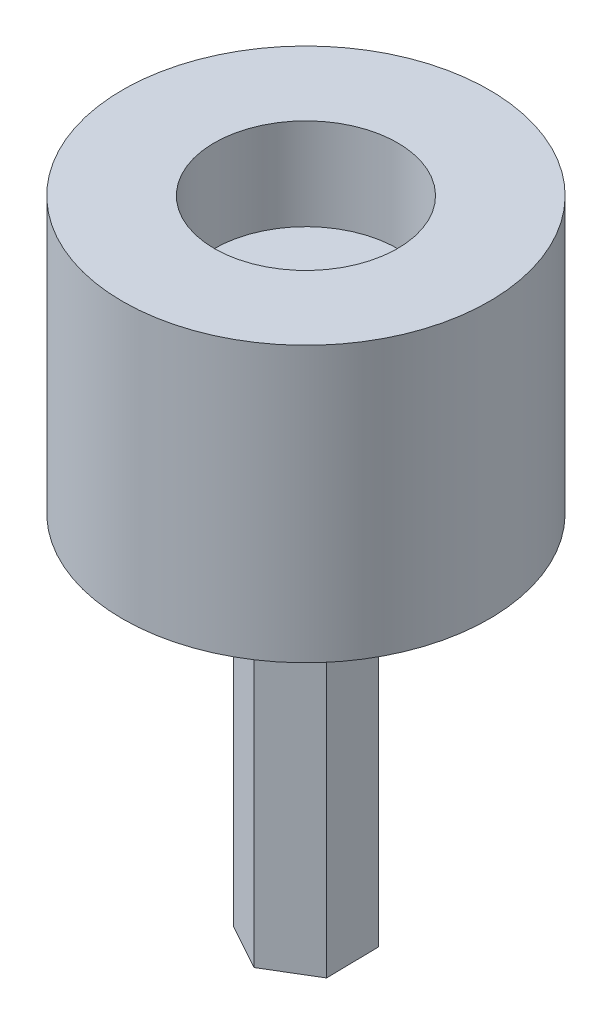
ISO-10303-21;
HEADER;
FILE_DESCRIPTION(('STEP AP214'),'2;1');
FILE_NAME('part.step','',(''),(''),'','','');
FILE_SCHEMA(('AUTOMOTIVE_DESIGN { 1 0 10303 214 1 1 1 1 }'));
ENDSEC;
DATA;
#1=APPLICATION_CONTEXT('core data for automotive mechanical design processes');
#2=APPLICATION_PROTOCOL_DEFINITION('international standard','automotive_design',2000,#1);
#3=PRODUCT_CONTEXT('',#1,'mechanical');
#4=PRODUCT('Part','Part','',(#3));
#5=PRODUCT_RELATED_PRODUCT_CATEGORY('part','',(#4));
#6=PRODUCT_DEFINITION_FORMATION('','',#4);
#7=PRODUCT_DEFINITION_CONTEXT('part definition',#1,'design');
#8=PRODUCT_DEFINITION('design','',#6,#7);
#9=PRODUCT_DEFINITION_SHAPE('','',#8);
#10=(LENGTH_UNIT() NAMED_UNIT(*) SI_UNIT(.MILLI.,.METRE.));
#11=(NAMED_UNIT(*) PLANE_ANGLE_UNIT() SI_UNIT($,.RADIAN.));
#12=(NAMED_UNIT(*) SI_UNIT($,.STERADIAN.) SOLID_ANGLE_UNIT());
#13=UNCERTAINTY_MEASURE_WITH_UNIT(LENGTH_MEASURE(1.E-05),#10,'distance_accuracy_value','');
#14=(GEOMETRIC_REPRESENTATION_CONTEXT(3) GLOBAL_UNCERTAINTY_ASSIGNED_CONTEXT((#13)) GLOBAL_UNIT_ASSIGNED_CONTEXT((#10,
#11,#12)) REPRESENTATION_CONTEXT('',''));
#15=CARTESIAN_POINT('',(0.,0.,0.));
#16=DIRECTION('',(0.,0.,1.));
#17=DIRECTION('',(1.,0.,0.));
#18=AXIS2_PLACEMENT_3D('',#15,#16,#17);
#19=CARTESIAN_POINT('',(-14.9904483099472,-2.,-0.572436988658976));
#20=DIRECTION('',(-0.0166409866472119,0.,-0.999861529194622));
#21=DIRECTION('',(-0.999861529194622,0.,0.0166409866472119));
#22=AXIS2_PLACEMENT_3D('',#19,#20,#21);
#23=CYLINDRICAL_SURFACE('',#22,2.);
#24=CARTESIAN_POINT('',(-14.9472137584057,-2.,2.02527946498892));
#25=DIRECTION('',(-0.514342281777834,0.,-0.857584991225693));
#26=DIRECTION('',(-0.857584991225693,0.,0.514342281777834));
#27=AXIS2_PLACEMENT_3D('',#24,#25,#26);
#28=ELLIPSE('',#27,2.3094010767585,2.);
#29=CARTESIAN_POINT('',(-14.9472137584057,0.,2.02527946498892));
#30=VERTEX_POINT('',#29);
#31=CARTESIAN_POINT('',(-12.9667060562571,-2.,0.837456845628765));
#32=VERTEX_POINT('',#31);
#33=EDGE_CURVE('E11',#30,#32,#28,.T.);
#34=ORIENTED_EDGE('',*,*,#33,.F.);
#35=DIRECTION('',(0.0166409866472119,0.,0.999861529194622));
#36=VECTOR('',#35,1.);
#37=CARTESIAN_POINT('',(-14.9904483099472,0.,-0.572436988658976));
#38=LINE('',#37,#36);
#39=CARTESIAN_POINT('',(-15.0336828614888,0.,-3.17015344230687));
#40=VERTEX_POINT('',#39);
#41=EDGE_CURVE('E164',#40,#30,#38,.T.);
#42=ORIENTED_EDGE('',*,*,#41,.F.);
#43=CARTESIAN_POINT('',(-15.0336828614888,-2.,-3.17015344230687));
#44=DIRECTION('',(0.485519247416788,0.,-0.874225977872905));
#45=DIRECTION('',(-0.874225977872904,0.,-0.485519247416788));
#46=AXIS2_PLACEMENT_3D('',#43,#44,#45);
#47=ELLIPSE('',#46,2.3094010767585,2.);
#48=CARTESIAN_POINT('',(-13.0147444468589,-2.,-2.04889476953556));
#49=VERTEX_POINT('',#48);
#50=EDGE_CURVE('E53',#40,#49,#47,.T.);
#51=ORIENTED_EDGE('',*,*,#50,.T.);
#52=DIRECTION('',(0.0166409866472119,0.,0.999861529194622));
#53=VECTOR('',#52,1.);
#54=CARTESIAN_POINT('',(-12.990725251558,-2.,-0.6057189619534));
#55=LINE('',#54,#53);
#56=EDGE_CURVE('E207',#32,#49,#55,.F.);
#57=ORIENTED_EDGE('',*,*,#56,.F.);
#58=EDGE_LOOP('',(#34,#42,#51,#57));
#59=FACE_BOUND('',#58,.T.);
#60=ADVANCED_FACE('F45',(#59),#23,.F.);
#61=CARTESIAN_POINT('',(-12.8056116965717,-2.,-4.50645388908705));
#62=DIRECTION('',(0.857584991225693,0.,-0.514342281777834));
#63=DIRECTION('',(-0.514342281777834,0.,-0.857584991225693));
#64=AXIS2_PLACEMENT_3D('',#61,#62,#63);
#65=CYLINDRICAL_SURFACE('',#64,2.);
#66=ORIENTED_EDGE('',*,*,#50,.F.);
#67=DIRECTION('',(-0.857584991225693,0.,0.514342281777834));
#68=VECTOR('',#67,1.);
#69=CARTESIAN_POINT('',(-12.8056116965717,0.,-4.50645388908705));
#70=LINE('',#69,#68);
#71=CARTESIAN_POINT('',(-10.5775405316546,0.,-5.84275433586722));
#72=VERTEX_POINT('',#71);
#73=EDGE_CURVE('E171',#72,#40,#70,.T.);
#74=ORIENTED_EDGE('',*,*,#73,.F.);
#75=CARTESIAN_POINT('',(-10.5775405316546,-2.,-5.84275433586722));
#76=DIRECTION('',(0.999861529194622,0.,-0.0166409866472118));
#77=DIRECTION('',(-0.0166409866472118,0.,-0.999861529194622));
#78=AXIS2_PLACEMENT_3D('',#75,#76,#77);
#79=ELLIPSE('',#78,2.3094010767585,2.);
#80=CARTESIAN_POINT('',(-10.5391098191732,-2.,-3.53367304373576));
#81=VERTEX_POINT('',#80);
#82=EDGE_CURVE('E67',#72,#81,#79,.T.);
#83=ORIENTED_EDGE('',*,*,#82,.T.);
#84=DIRECTION('',(-0.857584991225693,0.,0.514342281777834));
#85=VECTOR('',#84,1.);
#86=CARTESIAN_POINT('',(-11.776927133016,-2.,-2.79128390663566));
#87=LINE('',#86,#85);
#88=EDGE_CURVE('E204',#49,#81,#87,.F.);
#89=ORIENTED_EDGE('',*,*,#88,.F.);
#90=EDGE_LOOP('',(#66,#74,#83,#89));
#91=FACE_BOUND('',#90,.T.);
#92=ADVANCED_FACE('F272',(#91),#65,.F.);
#93=CARTESIAN_POINT('',(-8.30623481519589,-2.,-4.5813383289995));
#94=DIRECTION('',(0.874225977872905,0.,0.485519247416788));
#95=DIRECTION('',(0.485519247416788,0.,-0.874225977872905));
#96=AXIS2_PLACEMENT_3D('',#93,#94,#95);
#97=CYLINDRICAL_SURFACE('',#96,2.);
#98=ORIENTED_EDGE('',*,*,#82,.F.);
#99=DIRECTION('',(-0.874225977872905,0.,-0.485519247416788));
#100=VECTOR('',#99,1.);
#101=CARTESIAN_POINT('',(-8.30623481519589,0.,-4.5813383289995));
#102=LINE('',#101,#100);
#103=CARTESIAN_POINT('',(-6.03492909873721,0.,-3.31992232213178));
#104=VERTEX_POINT('',#103);
#105=EDGE_CURVE('E175',#104,#72,#102,.T.);
#106=ORIENTED_EDGE('',*,*,#105,.F.);
#107=CARTESIAN_POINT('',(-6.03492909873721,-2.,-3.31992232213178));
#108=DIRECTION('',(0.514342281777834,0.,0.857584991225693));
#109=DIRECTION('',(0.857584991225693,0.,-0.514342281777834));
#110=AXIS2_PLACEMENT_3D('',#107,#108,#109);
#111=ELLIPSE('',#110,2.3094010767585,2.);
#112=CARTESIAN_POINT('',(-8.01543680088575,-2.,-2.13209970277162));
#113=VERTEX_POINT('',#112);
#114=EDGE_CURVE('E216',#104,#113,#111,.T.);
#115=ORIENTED_EDGE('',*,*,#114,.T.);
#116=DIRECTION('',(-0.874225977872905,0.,-0.485519247416788));
#117=VECTOR('',#116,1.);
#118=CARTESIAN_POINT('',(-9.27727331002946,-2.,-2.83288637325369));
#119=LINE('',#118,#117);
#120=EDGE_CURVE('E142',#81,#113,#119,.F.);
#121=ORIENTED_EDGE('',*,*,#120,.F.);
#122=EDGE_LOOP('',(#98,#106,#115,#121));
#123=FACE_BOUND('',#122,.T.);
#124=ADVANCED_FACE('F223',(#123),#97,.F.);
#125=CARTESIAN_POINT('',(-5.99169454719564,-2.,-0.722205868483881));
#126=DIRECTION('',(0.0166409866472114,0.,0.999861529194622));
#127=DIRECTION('',(0.999861529194622,0.,-0.0166409866472114));
#128=AXIS2_PLACEMENT_3D('',#125,#126,#127);
#129=CYLINDRICAL_SURFACE('',#128,2.);
#130=ORIENTED_EDGE('',*,*,#114,.F.);
#131=DIRECTION('',(-0.0166409866472114,0.,-0.999861529194622));
#132=VECTOR('',#131,1.);
#133=CARTESIAN_POINT('',(-5.99169454719564,0.,-0.722205868483881));
#134=LINE('',#133,#132);
#135=CARTESIAN_POINT('',(-5.94845999565407,0.,1.87551058516401));
#136=VERTEX_POINT('',#135);
#137=EDGE_CURVE('E179',#136,#104,#134,.T.);
#138=ORIENTED_EDGE('',*,*,#137,.F.);
#139=CARTESIAN_POINT('',(-5.94845999565407,-2.,1.87551058516401));
#140=DIRECTION('',(-0.485519247416788,0.,0.874225977872904));
#141=DIRECTION('',(0.874225977872904,0.,0.485519247416788));
#142=AXIS2_PLACEMENT_3D('',#139,#140,#141);
#143=ELLIPSE('',#142,2.3094010767585,2.);
#144=CARTESIAN_POINT('',(-7.96739841028401,-2.,0.754251912392705));
#145=VERTEX_POINT('',#144);
#146=EDGE_CURVE('E213',#136,#145,#143,.T.);
#147=ORIENTED_EDGE('',*,*,#146,.T.);
#148=DIRECTION('',(-0.0166409866472114,0.,-0.999861529194622));
#149=VECTOR('',#148,1.);
#150=CARTESIAN_POINT('',(-7.99141760558488,-2.,-0.688923895189458));
#151=LINE('',#150,#149);
#152=EDGE_CURVE('E199',#113,#145,#151,.F.);
#153=ORIENTED_EDGE('',*,*,#152,.F.);
#154=EDGE_LOOP('',(#130,#138,#147,#153));
#155=FACE_BOUND('',#154,.T.);
#156=ADVANCED_FACE('F226',(#155),#129,.F.);
#157=CARTESIAN_POINT('',(-8.17653116057118,-2.,3.21181103194419));
#158=DIRECTION('',(-0.857584991225693,0.,0.514342281777834));
#159=DIRECTION('',(0.514342281777834,0.,0.857584991225693));
#160=AXIS2_PLACEMENT_3D('',#157,#158,#159);
#161=CYLINDRICAL_SURFACE('',#160,2.);
#162=ORIENTED_EDGE('',*,*,#146,.F.);
#163=DIRECTION('',(0.857584991225693,0.,-0.514342281777834));
#164=VECTOR('',#163,1.);
#165=CARTESIAN_POINT('',(-8.17653116057118,0.,3.21181103194419));
#166=LINE('',#165,#164);
#167=CARTESIAN_POINT('',(-10.4046023254883,0.,4.54811147872436));
#168=VERTEX_POINT('',#167);
#169=EDGE_CURVE('E183',#168,#136,#166,.T.);
#170=ORIENTED_EDGE('',*,*,#169,.F.);
#171=CARTESIAN_POINT('',(-10.4046023254883,-2.,4.54811147872436));
#172=DIRECTION('',(-0.999861529194622,0.,0.0166409866472119));
#173=DIRECTION('',(0.0166409866472119,0.,0.999861529194622));
#174=AXIS2_PLACEMENT_3D('',#171,#172,#173);
#175=ELLIPSE('',#174,2.3094010767585,2.);
#176=CARTESIAN_POINT('',(-10.4430330379697,-2.,2.2390301865929));
#177=VERTEX_POINT('',#176);
#178=EDGE_CURVE('E210',#168,#177,#175,.T.);
#179=ORIENTED_EDGE('',*,*,#178,.T.);
#180=DIRECTION('',(0.857584991225693,0.,-0.514342281777834));
#181=VECTOR('',#180,1.);
#182=CARTESIAN_POINT('',(-9.20521572412685,-2.,1.4966410494928));
#183=LINE('',#182,#181);
#184=EDGE_CURVE('E195',#145,#177,#183,.F.);
#185=ORIENTED_EDGE('',*,*,#184,.F.);
#186=EDGE_LOOP('',(#162,#170,#179,#185));
#187=FACE_BOUND('',#186,.T.);
#188=ADVANCED_FACE('F233',(#187),#161,.F.);
#189=CARTESIAN_POINT('',(-12.675908041947,-2.,3.28669547185664));
#190=DIRECTION('',(-0.874225977872905,0.,-0.485519247416788));
#191=DIRECTION('',(-0.485519247416788,0.,0.874225977872905));
#192=AXIS2_PLACEMENT_3D('',#189,#190,#191);
#193=CYLINDRICAL_SURFACE('',#192,2.);
#194=DIRECTION('',(0.874225977872905,0.,0.485519247416788));
#195=VECTOR('',#194,1.);
#196=CARTESIAN_POINT('',(-12.675908041947,0.,3.28669547185664));
#197=LINE('',#196,#195);
#198=EDGE_CURVE('E187',#30,#168,#197,.T.);
#199=ORIENTED_EDGE('',*,*,#198,.F.);
#200=ORIENTED_EDGE('',*,*,#33,.T.);
#201=DIRECTION('',(0.874225977872905,0.,0.485519247416788));
#202=VECTOR('',#201,1.);
#203=CARTESIAN_POINT('',(-11.7048695471134,-2.,1.53824351611083));
#204=LINE('',#203,#202);
#205=EDGE_CURVE('E191',#177,#32,#204,.F.);
#206=ORIENTED_EDGE('',*,*,#205,.F.);
#207=ORIENTED_EDGE('',*,*,#178,.F.);
#208=EDGE_LOOP('',(#199,#200,#206,#207));
#209=FACE_BOUND('',#208,.T.);
#210=ADVANCED_FACE('F274',(#209),#193,.F.);
#211=CARTESIAN_POINT('',(-10.4910714285714,0.,-0.64732142857143));
#212=DIRECTION('',(0.,1.,0.));
#213=DIRECTION('',(0.,0.,1.));
#214=AXIS2_PLACEMENT_3D('',#211,#212,#213);
#215=PLANE('',#214);
#216=ORIENTED_EDGE('',*,*,#41,.T.);
#217=ORIENTED_EDGE('',*,*,#198,.T.);
#218=ORIENTED_EDGE('',*,*,#169,.T.);
#219=ORIENTED_EDGE('',*,*,#137,.T.);
#220=ORIENTED_EDGE('',*,*,#105,.T.);
#221=ORIENTED_EDGE('',*,*,#73,.T.);
#222=EDGE_LOOP('',(#216,#217,#218,#219,#220,#221));
#223=FACE_BOUND('',#222,.T.);
#224=CARTESIAN_POINT('',(-10.4910714285714,0.,-0.64732142857143));
#225=DIRECTION('',(0.,1.,0.));
#226=DIRECTION('',(0.,0.,1.));
#227=AXIS2_PLACEMENT_3D('',#224,#225,#226);
#228=CIRCLE('',#227,10.);
#229=CARTESIAN_POINT('',(-10.4910714285714,0.,9.35267857142857));
#230=VERTEX_POINT('',#229);
#231=EDGE_CURVE('E158',#230,#230,#228,.T.);
#232=ORIENTED_EDGE('',*,*,#231,.F.);
#233=EDGE_LOOP('',(#232));
#234=FACE_BOUND('',#233,.T.);
#235=ADVANCED_FACE('F228',(#223,#234),#215,.F.);
#236=CARTESIAN_POINT('',(-10.4910714285714,15.,-0.64732142857143));
#237=DIRECTION('',(0.,-1.,0.));
#238=DIRECTION('',(0.,0.,-1.));
#239=AXIS2_PLACEMENT_3D('',#236,#237,#238);
#240=CYLINDRICAL_SURFACE('',#239,10.);
#241=CARTESIAN_POINT('',(-10.4910714285714,15.,-0.64732142857143));
#242=DIRECTION('',(0.,1.,0.));
#243=DIRECTION('',(0.,0.,1.));
#244=AXIS2_PLACEMENT_3D('',#241,#242,#243);
#245=CIRCLE('',#244,10.);
#246=CARTESIAN_POINT('',(-10.4910714285714,15.,9.35267857142857));
#247=VERTEX_POINT('',#246);
#248=EDGE_CURVE('E160',#247,#247,#245,.T.);
#249=ORIENTED_EDGE('',*,*,#248,.F.);
#250=EDGE_LOOP('',(#249));
#251=FACE_BOUND('',#250,.T.);
#252=ORIENTED_EDGE('',*,*,#231,.T.);
#253=EDGE_LOOP('',(#252));
#254=FACE_BOUND('',#253,.T.);
#255=ADVANCED_FACE('F281',(#251,#254),#240,.T.);
#256=CARTESIAN_POINT('',(-10.4910714285714,15.,-0.64732142857143));
#257=DIRECTION('',(0.,1.,0.));
#258=DIRECTION('',(0.,0.,1.));
#259=AXIS2_PLACEMENT_3D('',#256,#257,#258);
#260=PLANE('',#259);
#261=CARTESIAN_POINT('',(-10.4910714285714,15.,-0.647321428571429));
#262=DIRECTION('',(0.,1.,0.));
#263=DIRECTION('',(0.,0.,1.));
#264=AXIS2_PLACEMENT_3D('',#261,#262,#263);
#265=CIRCLE('',#264,5.);
#266=CARTESIAN_POINT('',(-10.4910714285714,15.,4.35267857142857));
#267=VERTEX_POINT('',#266);
#268=EDGE_CURVE('E145',#267,#267,#265,.T.);
#269=ORIENTED_EDGE('',*,*,#268,.F.);
#270=EDGE_LOOP('',(#269));
#271=FACE_BOUND('',#270,.T.);
#272=ORIENTED_EDGE('',*,*,#248,.T.);
#273=EDGE_LOOP('',(#272));
#274=FACE_BOUND('',#273,.T.);
#275=ADVANCED_FACE('F395',(#271,#274),#260,.T.);
#276=CARTESIAN_POINT('',(-10.4910714285714,10.,-0.647321428571429));
#277=DIRECTION('',(0.,1.,0.));
#278=DIRECTION('',(0.,0.,1.));
#279=AXIS2_PLACEMENT_3D('',#276,#277,#278);
#280=CYLINDRICAL_SURFACE('',#279,5.);
#281=CARTESIAN_POINT('',(-10.4910714285714,10.,-0.647321428571429));
#282=DIRECTION('',(0.,1.,0.));
#283=DIRECTION('',(0.,0.,1.));
#284=AXIS2_PLACEMENT_3D('',#281,#282,#283);
#285=CIRCLE('',#284,5.);
#286=CARTESIAN_POINT('',(-10.4910714285714,10.,4.35267857142857));
#287=VERTEX_POINT('',#286);
#288=EDGE_CURVE('E150',#287,#287,#285,.T.);
#289=ORIENTED_EDGE('',*,*,#288,.F.);
#290=EDGE_LOOP('',(#289));
#291=FACE_BOUND('',#290,.T.);
#292=ORIENTED_EDGE('',*,*,#268,.T.);
#293=EDGE_LOOP('',(#292));
#294=FACE_BOUND('',#293,.T.);
#295=ADVANCED_FACE('F386',(#291,#294),#280,.F.);
#296=CARTESIAN_POINT('',(-10.4910714285714,10.,-0.647321428571429));
#297=DIRECTION('',(0.,1.,0.));
#298=DIRECTION('',(0.,0.,1.));
#299=AXIS2_PLACEMENT_3D('',#296,#297,#298);
#300=PLANE('',#299);
#301=ORIENTED_EDGE('',*,*,#288,.T.);
#302=EDGE_LOOP('',(#301));
#303=FACE_BOUND('',#302,.T.);
#304=ADVANCED_FACE('F372',(#303),#300,.T.);
#305=CARTESIAN_POINT('',(-10.5391098191732,-20.,-3.53367304373576));
#306=DIRECTION('',(-0.485519247416788,0.,0.874225977872905));
#307=DIRECTION('',(0.874225977872905,0.,0.485519247416788));
#308=AXIS2_PLACEMENT_3D('',#305,#306,#307);
#309=PLANE('',#308);
#310=DIRECTION('',(0.,1.,0.));
#311=VECTOR('',#310,1.);
#312=CARTESIAN_POINT('',(-10.5391098191732,-20.,-3.53367304373576));
#313=LINE('',#312,#311);
#314=CARTESIAN_POINT('',(-10.5391098191732,-20.,-3.53367304373576));
#315=VERTEX_POINT('',#314);
#316=EDGE_CURVE('E252',#315,#81,#313,.T.);
#317=ORIENTED_EDGE('',*,*,#316,.T.);
#318=ORIENTED_EDGE('',*,*,#120,.T.);
#319=DIRECTION('',(0.,1.,0.));
#320=VECTOR('',#319,1.);
#321=CARTESIAN_POINT('',(-8.01543680088575,-20.,-2.13209970277162));
#322=LINE('',#321,#320);
#323=CARTESIAN_POINT('',(-8.01543680088575,-20.,-2.13209970277162));
#324=VERTEX_POINT('',#323);
#325=EDGE_CURVE('E121',#324,#113,#322,.T.);
#326=ORIENTED_EDGE('',*,*,#325,.F.);
#327=DIRECTION('',(0.874225977872904,0.,0.485519247416788));
#328=VECTOR('',#327,1.);
#329=CARTESIAN_POINT('',(-10.5391098191732,-20.,-3.53367304373576));
#330=LINE('',#329,#328);
#331=EDGE_CURVE('E128',#315,#324,#330,.T.);
#332=ORIENTED_EDGE('',*,*,#331,.F.);
#333=EDGE_LOOP('',(#317,#318,#326,#332));
#334=FACE_BOUND('',#333,.T.);
#335=ADVANCED_FACE('F140',(#334),#309,.F.);
#336=CARTESIAN_POINT('',(-8.01543680088575,-20.,-2.13209970277162));
#337=DIRECTION('',(-0.999861529194622,0.,0.0166409866472114));
#338=DIRECTION('',(0.0166409866472114,0.,0.999861529194622));
#339=AXIS2_PLACEMENT_3D('',#336,#337,#338);
#340=PLANE('',#339);
#341=ORIENTED_EDGE('',*,*,#325,.T.);
#342=ORIENTED_EDGE('',*,*,#152,.T.);
#343=DIRECTION('',(0.,1.,0.));
#344=VECTOR('',#343,1.);
#345=CARTESIAN_POINT('',(-7.96739841028401,-20.,0.754251912392705));
#346=LINE('',#345,#344);
#347=CARTESIAN_POINT('',(-7.96739841028401,-20.,0.754251912392705));
#348=VERTEX_POINT('',#347);
#349=EDGE_CURVE('E123',#348,#145,#346,.T.);
#350=ORIENTED_EDGE('',*,*,#349,.F.);
#351=DIRECTION('',(0.0166409866472113,0.,0.999861529194622));
#352=VECTOR('',#351,1.);
#353=CARTESIAN_POINT('',(-8.01543680088575,-20.,-2.13209970277162));
#354=LINE('',#353,#352);
#355=EDGE_CURVE('E116',#324,#348,#354,.T.);
#356=ORIENTED_EDGE('',*,*,#355,.F.);
#357=EDGE_LOOP('',(#341,#342,#350,#356));
#358=FACE_BOUND('',#357,.T.);
#359=ADVANCED_FACE('F118',(#358),#340,.F.);
#360=CARTESIAN_POINT('',(-7.96739841028401,-20.,0.754251912392705));
#361=DIRECTION('',(-0.514342281777834,0.,-0.857584991225693));
#362=DIRECTION('',(-0.857584991225693,0.,0.514342281777834));
#363=AXIS2_PLACEMENT_3D('',#360,#361,#362);
#364=PLANE('',#363);
#365=ORIENTED_EDGE('',*,*,#349,.T.);
#366=ORIENTED_EDGE('',*,*,#184,.T.);
#367=DIRECTION('',(0.,1.,0.));
#368=VECTOR('',#367,1.);
#369=CARTESIAN_POINT('',(-10.4430330379697,-20.,2.2390301865929));
#370=LINE('',#369,#368);
#371=CARTESIAN_POINT('',(-10.4430330379697,-20.,2.2390301865929));
#372=VERTEX_POINT('',#371);
#373=EDGE_CURVE('E152',#372,#177,#370,.T.);
#374=ORIENTED_EDGE('',*,*,#373,.F.);
#375=DIRECTION('',(-0.857584991225693,0.,0.514342281777834));
#376=VECTOR('',#375,1.);
#377=CARTESIAN_POINT('',(-7.96739841028401,-20.,0.754251912392705));
#378=LINE('',#377,#376);
#379=EDGE_CURVE('E127',#348,#372,#378,.T.);
#380=ORIENTED_EDGE('',*,*,#379,.F.);
#381=EDGE_LOOP('',(#365,#366,#374,#380));
#382=FACE_BOUND('',#381,.T.);
#383=ADVANCED_FACE('F238',(#382),#364,.F.);
#384=CARTESIAN_POINT('',(-10.4430330379697,-20.,2.2390301865929));
#385=DIRECTION('',(0.485519247416788,0.,-0.874225977872905));
#386=DIRECTION('',(-0.874225977872905,0.,-0.485519247416788));
#387=AXIS2_PLACEMENT_3D('',#384,#385,#386);
#388=PLANE('',#387);
#389=ORIENTED_EDGE('',*,*,#373,.T.);
#390=ORIENTED_EDGE('',*,*,#205,.T.);
#391=DIRECTION('',(0.,1.,0.));
#392=VECTOR('',#391,1.);
#393=CARTESIAN_POINT('',(-12.9667060562571,-20.,0.837456845628765));
#394=LINE('',#393,#392);
#395=CARTESIAN_POINT('',(-12.9667060562571,-20.,0.837456845628765));
#396=VERTEX_POINT('',#395);
#397=EDGE_CURVE('E259',#396,#32,#394,.T.);
#398=ORIENTED_EDGE('',*,*,#397,.F.);
#399=DIRECTION('',(-0.874225977872905,0.,-0.485519247416788));
#400=VECTOR('',#399,1.);
#401=CARTESIAN_POINT('',(-10.4430330379697,-20.,2.2390301865929));
#402=LINE('',#401,#400);
#403=EDGE_CURVE('E242',#372,#396,#402,.T.);
#404=ORIENTED_EDGE('',*,*,#403,.F.);
#405=EDGE_LOOP('',(#389,#390,#398,#404));
#406=FACE_BOUND('',#405,.T.);
#407=ADVANCED_FACE('F264',(#406),#388,.F.);
#408=CARTESIAN_POINT('',(-12.9667060562571,-20.,0.837456845628765));
#409=DIRECTION('',(0.999861529194622,0.,-0.0166409866472119));
#410=DIRECTION('',(-0.0166409866472119,0.,-0.999861529194622));
#411=AXIS2_PLACEMENT_3D('',#408,#409,#410);
#412=PLANE('',#411);
#413=ORIENTED_EDGE('',*,*,#397,.T.);
#414=ORIENTED_EDGE('',*,*,#56,.T.);
#415=DIRECTION('',(0.,1.,0.));
#416=VECTOR('',#415,1.);
#417=CARTESIAN_POINT('',(-13.0147444468589,-20.,-2.04889476953556));
#418=LINE('',#417,#416);
#419=CARTESIAN_POINT('',(-13.0147444468589,-20.,-2.04889476953556));
#420=VERTEX_POINT('',#419);
#421=EDGE_CURVE('E255',#420,#49,#418,.T.);
#422=ORIENTED_EDGE('',*,*,#421,.F.);
#423=DIRECTION('',(-0.0166409866472119,0.,-0.999861529194622));
#424=VECTOR('',#423,1.);
#425=CARTESIAN_POINT('',(-12.9667060562571,-20.,0.837456845628765));
#426=LINE('',#425,#424);
#427=EDGE_CURVE('E245',#396,#420,#426,.T.);
#428=ORIENTED_EDGE('',*,*,#427,.F.);
#429=EDGE_LOOP('',(#413,#414,#422,#428));
#430=FACE_BOUND('',#429,.T.);
#431=ADVANCED_FACE('F269',(#430),#412,.F.);
#432=CARTESIAN_POINT('',(-13.0147444468589,-20.,-2.04889476953556));
#433=DIRECTION('',(0.514342281777834,0.,0.857584991225693));
#434=DIRECTION('',(0.857584991225693,0.,-0.514342281777834));
#435=AXIS2_PLACEMENT_3D('',#432,#433,#434);
#436=PLANE('',#435);
#437=ORIENTED_EDGE('',*,*,#421,.T.);
#438=ORIENTED_EDGE('',*,*,#88,.T.);
#439=ORIENTED_EDGE('',*,*,#316,.F.);
#440=DIRECTION('',(0.857584991225693,0.,-0.514342281777834));
#441=VECTOR('',#440,1.);
#442=CARTESIAN_POINT('',(-13.0147444468589,-20.,-2.04889476953556));
#443=LINE('',#442,#441);
#444=EDGE_CURVE('E133',#420,#315,#443,.T.);
#445=ORIENTED_EDGE('',*,*,#444,.F.);
#446=EDGE_LOOP('',(#437,#438,#439,#445));
#447=FACE_BOUND('',#446,.T.);
#448=ADVANCED_FACE('F271',(#447),#436,.F.);
#449=CARTESIAN_POINT('',(0.,-20.,0.));
#450=DIRECTION('',(0.,-1.,0.));
#451=DIRECTION('',(0.,0.,-1.));
#452=AXIS2_PLACEMENT_3D('',#449,#450,#451);
#453=PLANE('',#452);
#454=ORIENTED_EDGE('',*,*,#331,.T.);
#455=ORIENTED_EDGE('',*,*,#355,.T.);
#456=ORIENTED_EDGE('',*,*,#379,.T.);
#457=ORIENTED_EDGE('',*,*,#403,.T.);
#458=ORIENTED_EDGE('',*,*,#427,.T.);
#459=ORIENTED_EDGE('',*,*,#444,.T.);
#460=EDGE_LOOP('',(#454,#455,#456,#457,#458,#459));
#461=FACE_BOUND('',#460,.T.);
#462=ADVANCED_FACE('F131',(#461),#453,.T.);
#463=CLOSED_SHELL('',(#60,#92,#124,#156,#188,#210,#235,#255,#275,#295,#304,#335,#359,#383,#407,
#431,#448,#462));
#464=MANIFOLD_SOLID_BREP('B2',#463);
#465=ADVANCED_BREP_SHAPE_REPRESENTATION('',(#18,#464),#14);
#466=SHAPE_DEFINITION_REPRESENTATION(#9,#465);
ENDSEC;
END-ISO-10303-21;
